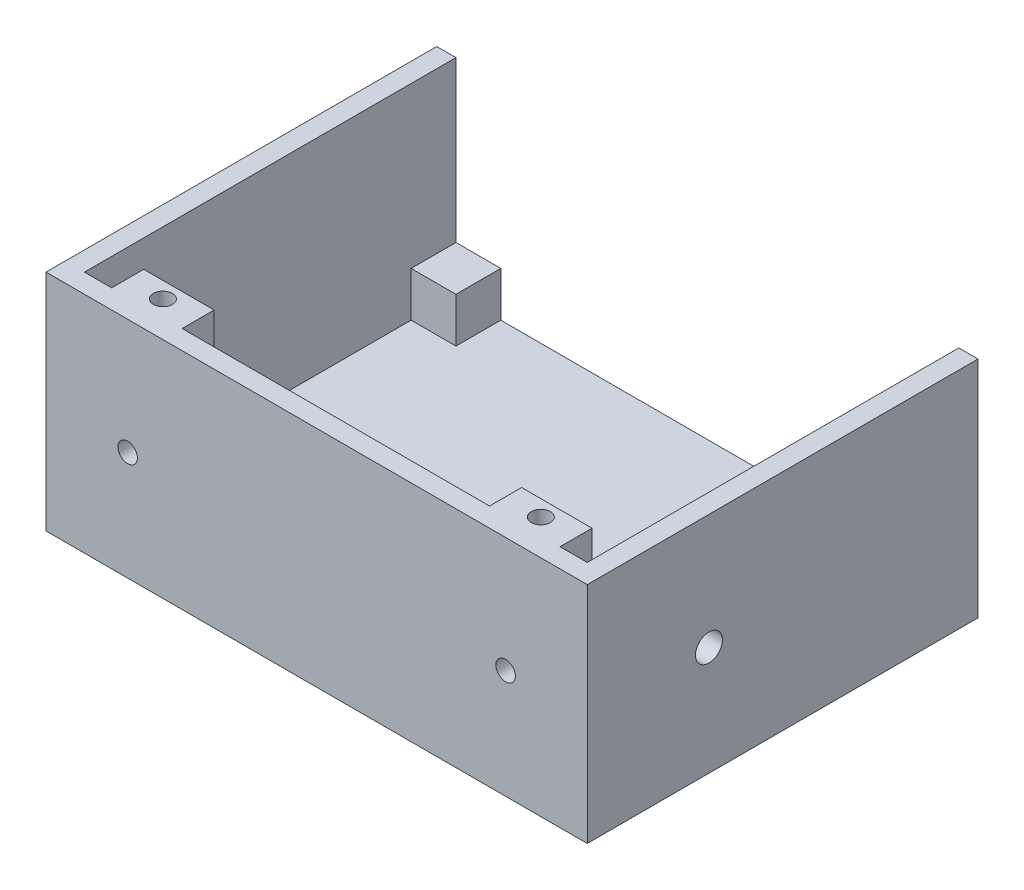
ISO-10303-21;
HEADER;
FILE_DESCRIPTION(('STEP AP214'),'2;1');
FILE_NAME('part.step','',(''),(''),'','','');
FILE_SCHEMA(('AUTOMOTIVE_DESIGN { 1 0 10303 214 1 1 1 1 }'));
ENDSEC;
DATA;
#1=APPLICATION_CONTEXT('core data for automotive mechanical design processes');
#2=APPLICATION_PROTOCOL_DEFINITION('international standard','automotive_design',2000,#1);
#3=PRODUCT_CONTEXT('',#1,'mechanical');
#4=PRODUCT('Part','Part','',(#3));
#5=PRODUCT_RELATED_PRODUCT_CATEGORY('part','',(#4));
#6=PRODUCT_DEFINITION_FORMATION('','',#4);
#7=PRODUCT_DEFINITION_CONTEXT('part definition',#1,'design');
#8=PRODUCT_DEFINITION('design','',#6,#7);
#9=PRODUCT_DEFINITION_SHAPE('','',#8);
#10=(LENGTH_UNIT() NAMED_UNIT(*) SI_UNIT(.MILLI.,.METRE.));
#11=(NAMED_UNIT(*) PLANE_ANGLE_UNIT() SI_UNIT($,.RADIAN.));
#12=(NAMED_UNIT(*) SI_UNIT($,.STERADIAN.) SOLID_ANGLE_UNIT());
#13=UNCERTAINTY_MEASURE_WITH_UNIT(LENGTH_MEASURE(1.E-05),#10,'distance_accuracy_value','');
#14=(GEOMETRIC_REPRESENTATION_CONTEXT(3) GLOBAL_UNCERTAINTY_ASSIGNED_CONTEXT((#13)) GLOBAL_UNIT_ASSIGNED_CONTEXT((#10,
#11,#12)) REPRESENTATION_CONTEXT('',''));
#15=CARTESIAN_POINT('',(0.,0.,0.));
#16=DIRECTION('',(0.,0.,1.));
#17=DIRECTION('',(1.,0.,0.));
#18=AXIS2_PLACEMENT_3D('',#15,#16,#17);
#19=CARTESIAN_POINT('',(42.25,3.,-58.));
#20=DIRECTION('',(0.,1.,0.));
#21=DIRECTION('',(0.,0.,1.));
#22=AXIS2_PLACEMENT_3D('',#19,#20,#21);
#23=PLANE('',#22);
#24=DIRECTION('',(0.,0.,1.));
#25=VECTOR('',#24,1.);
#26=CARTESIAN_POINT('',(-32.25,3.,-58.));
#27=LINE('',#26,#25);
#28=CARTESIAN_POINT('',(-32.25,3.,-58.));
#29=VERTEX_POINT('',#28);
#30=CARTESIAN_POINT('',(-32.25,3.,-51.));
#31=VERTEX_POINT('',#30);
#32=EDGE_CURVE('E107',#29,#31,#27,.T.);
#33=ORIENTED_EDGE('',*,*,#32,.T.);
#34=DIRECTION('',(1.,0.,0.));
#35=VECTOR('',#34,1.);
#36=CARTESIAN_POINT('',(-39.25,3.,-51.));
#37=LINE('',#36,#35);
#38=CARTESIAN_POINT('',(-39.25,3.,-51.));
#39=VERTEX_POINT('',#38);
#40=EDGE_CURVE('E265',#39,#31,#37,.T.);
#41=ORIENTED_EDGE('',*,*,#40,.F.);
#42=DIRECTION('',(0.,0.,1.));
#43=VECTOR('',#42,1.);
#44=CARTESIAN_POINT('',(-39.25,3.,-58.));
#45=LINE('',#44,#43);
#46=CARTESIAN_POINT('',(-39.25,3.,0.));
#47=VERTEX_POINT('',#46);
#48=EDGE_CURVE('E245',#39,#47,#45,.T.);
#49=ORIENTED_EDGE('',*,*,#48,.T.);
#50=DIRECTION('',(-1.,0.,0.));
#51=VECTOR('',#50,1.);
#52=CARTESIAN_POINT('',(42.25,3.,0.));
#53=LINE('',#52,#51);
#54=CARTESIAN_POINT('',(39.25,3.,0.));
#55=VERTEX_POINT('',#54);
#56=EDGE_CURVE('E393',#55,#47,#53,.T.);
#57=ORIENTED_EDGE('',*,*,#56,.F.);
#58=DIRECTION('',(0.,0.,1.));
#59=VECTOR('',#58,1.);
#60=CARTESIAN_POINT('',(39.25,3.,-58.));
#61=LINE('',#60,#59);
#62=CARTESIAN_POINT('',(39.25,3.,-51.));
#63=VERTEX_POINT('',#62);
#64=EDGE_CURVE('E369',#63,#55,#61,.T.);
#65=ORIENTED_EDGE('',*,*,#64,.F.);
#66=DIRECTION('',(-1.,0.,0.));
#67=VECTOR('',#66,1.);
#68=CARTESIAN_POINT('',(0.,3.,-51.));
#69=LINE('',#68,#67);
#70=CARTESIAN_POINT('',(32.25,3.,-51.));
#71=VERTEX_POINT('',#70);
#72=EDGE_CURVE('E274',#63,#71,#69,.T.);
#73=ORIENTED_EDGE('',*,*,#72,.T.);
#74=DIRECTION('',(0.,0.,1.));
#75=VECTOR('',#74,1.);
#76=CARTESIAN_POINT('',(32.25,3.,0.));
#77=LINE('',#76,#75);
#78=CARTESIAN_POINT('',(32.25,3.,-58.));
#79=VERTEX_POINT('',#78);
#80=EDGE_CURVE('E283',#79,#71,#77,.T.);
#81=ORIENTED_EDGE('',*,*,#80,.F.);
#82=DIRECTION('',(-1.,0.,0.));
#83=VECTOR('',#82,1.);
#84=CARTESIAN_POINT('',(42.25,3.,-58.));
#85=LINE('',#84,#83);
#86=EDGE_CURVE('E112',#79,#29,#85,.T.);
#87=ORIENTED_EDGE('',*,*,#86,.T.);
#88=EDGE_LOOP('',(#33,#41,#49,#57,#65,#73,#81,#87));
#89=FACE_BOUND('',#88,.T.);
#90=ADVANCED_FACE('F90',(#89),#23,.T.);
#91=CARTESIAN_POINT('',(-39.25,0.,-58.));
#92=DIRECTION('',(-1.,0.,0.));
#93=DIRECTION('',(0.,0.,1.));
#94=AXIS2_PLACEMENT_3D('',#91,#92,#93);
#95=PLANE('',#94);
#96=DIRECTION('',(0.,-1.,0.));
#97=VECTOR('',#96,1.);
#98=CARTESIAN_POINT('',(-39.25,10.,-51.));
#99=LINE('',#98,#97);
#100=CARTESIAN_POINT('',(-39.25,10.,-51.));
#101=VERTEX_POINT('',#100);
#102=EDGE_CURVE('E239',#101,#39,#99,.T.);
#103=ORIENTED_EDGE('',*,*,#102,.F.);
#104=DIRECTION('',(0.,0.,1.));
#105=VECTOR('',#104,1.);
#106=CARTESIAN_POINT('',(-39.25,10.,-58.));
#107=LINE('',#106,#105);
#108=CARTESIAN_POINT('',(-39.25,10.,-58.));
#109=VERTEX_POINT('',#108);
#110=EDGE_CURVE('E242',#109,#101,#107,.T.);
#111=ORIENTED_EDGE('',*,*,#110,.F.);
#112=DIRECTION('',(0.,-1.,0.));
#113=VECTOR('',#112,1.);
#114=CARTESIAN_POINT('',(-39.25,0.,-58.));
#115=LINE('',#114,#113);
#116=CARTESIAN_POINT('',(-39.25,35.,-58.));
#117=VERTEX_POINT('',#116);
#118=EDGE_CURVE('E386',#117,#109,#115,.T.);
#119=ORIENTED_EDGE('',*,*,#118,.F.);
#120=DIRECTION('',(0.,0.,1.));
#121=VECTOR('',#120,1.);
#122=CARTESIAN_POINT('',(-39.25,35.,-58.));
#123=LINE('',#122,#121);
#124=CARTESIAN_POINT('',(-39.25,35.,0.));
#125=VERTEX_POINT('',#124);
#126=EDGE_CURVE('E390',#117,#125,#123,.T.);
#127=ORIENTED_EDGE('',*,*,#126,.T.);
#128=DIRECTION('',(0.,-1.,0.));
#129=VECTOR('',#128,1.);
#130=CARTESIAN_POINT('',(-39.25,0.,0.));
#131=LINE('',#130,#129);
#132=EDGE_CURVE('E378',#125,#47,#131,.T.);
#133=ORIENTED_EDGE('',*,*,#132,.T.);
#134=ORIENTED_EDGE('',*,*,#48,.F.);
#135=EDGE_LOOP('',(#103,#111,#119,#127,#133,#134));
#136=FACE_BOUND('',#135,.T.);
#137=ADVANCED_FACE('F241',(#136),#95,.F.);
#138=CARTESIAN_POINT('',(0.,0.,0.));
#139=DIRECTION('',(0.,0.,1.));
#140=DIRECTION('',(1.,0.,0.));
#141=AXIS2_PLACEMENT_3D('',#138,#139,#140);
#142=PLANE('',#141);
#143=CARTESIAN_POINT('',(29.5,17.,0.));
#144=DIRECTION('',(0.,0.,1.));
#145=DIRECTION('',(1.,0.,0.));
#146=AXIS2_PLACEMENT_3D('',#143,#144,#145);
#147=CIRCLE('',#146,1.52);
#148=CARTESIAN_POINT('',(31.02,17.,0.));
#149=VERTEX_POINT('',#148);
#150=EDGE_CURVE('E404',#149,#149,#147,.T.);
#151=ORIENTED_EDGE('',*,*,#150,.T.);
#152=EDGE_LOOP('',(#151));
#153=FACE_BOUND('',#152,.T.);
#154=CARTESIAN_POINT('',(-29.5,17.,0.));
#155=DIRECTION('',(0.,0.,1.));
#156=DIRECTION('',(1.,0.,0.));
#157=AXIS2_PLACEMENT_3D('',#154,#155,#156);
#158=CIRCLE('',#157,1.52);
#159=CARTESIAN_POINT('',(-27.98,17.,0.));
#160=VERTEX_POINT('',#159);
#161=EDGE_CURVE('E410',#160,#160,#158,.T.);
#162=ORIENTED_EDGE('',*,*,#161,.T.);
#163=EDGE_LOOP('',(#162));
#164=FACE_BOUND('',#163,.T.);
#165=DIRECTION('',(1.,0.,0.));
#166=VECTOR('',#165,1.);
#167=CARTESIAN_POINT('',(0.,35.,0.));
#168=LINE('',#167,#166);
#169=CARTESIAN_POINT('',(-35.,35.,0.));
#170=VERTEX_POINT('',#169);
#171=EDGE_CURVE('E423',#125,#170,#168,.T.);
#172=ORIENTED_EDGE('',*,*,#171,.T.);
#173=DIRECTION('',(0.,-1.,0.));
#174=VECTOR('',#173,1.);
#175=CARTESIAN_POINT('',(-35.,35.,0.));
#176=LINE('',#175,#174);
#177=CARTESIAN_POINT('',(-35.,28.,0.));
#178=VERTEX_POINT('',#177);
#179=EDGE_CURVE('E325',#170,#178,#176,.T.);
#180=ORIENTED_EDGE('',*,*,#179,.T.);
#181=DIRECTION('',(1.,0.,0.));
#182=VECTOR('',#181,1.);
#183=CARTESIAN_POINT('',(-29.5,28.,0.));
#184=LINE('',#183,#182);
#185=CARTESIAN_POINT('',(-24.,28.,0.));
#186=VERTEX_POINT('',#185);
#187=EDGE_CURVE('E319',#178,#186,#184,.T.);
#188=ORIENTED_EDGE('',*,*,#187,.T.);
#189=DIRECTION('',(0.,-1.,0.));
#190=VECTOR('',#189,1.);
#191=CARTESIAN_POINT('',(-24.,35.,0.));
#192=LINE('',#191,#190);
#193=CARTESIAN_POINT('',(-24.,35.,0.));
#194=VERTEX_POINT('',#193);
#195=EDGE_CURVE('E321',#194,#186,#192,.T.);
#196=ORIENTED_EDGE('',*,*,#195,.F.);
#197=CARTESIAN_POINT('',(24.,35.,0.));
#198=VERTEX_POINT('',#197);
#199=EDGE_CURVE('E431',#194,#198,#168,.T.);
#200=ORIENTED_EDGE('',*,*,#199,.T.);
#201=DIRECTION('',(0.,1.,0.));
#202=VECTOR('',#201,1.);
#203=CARTESIAN_POINT('',(24.,0.,0.));
#204=LINE('',#203,#202);
#205=CARTESIAN_POINT('',(24.,28.,0.));
#206=VERTEX_POINT('',#205);
#207=EDGE_CURVE('E341',#206,#198,#204,.T.);
#208=ORIENTED_EDGE('',*,*,#207,.F.);
#209=DIRECTION('',(1.,0.,0.));
#210=VECTOR('',#209,1.);
#211=CARTESIAN_POINT('',(0.,28.,0.));
#212=LINE('',#211,#210);
#213=CARTESIAN_POINT('',(35.,28.,0.));
#214=VERTEX_POINT('',#213);
#215=EDGE_CURVE('E351',#206,#214,#212,.T.);
#216=ORIENTED_EDGE('',*,*,#215,.T.);
#217=DIRECTION('',(0.,1.,0.));
#218=VECTOR('',#217,1.);
#219=CARTESIAN_POINT('',(35.,0.,0.));
#220=LINE('',#219,#218);
#221=CARTESIAN_POINT('',(35.,35.,0.));
#222=VERTEX_POINT('',#221);
#223=EDGE_CURVE('E327',#214,#222,#220,.T.);
#224=ORIENTED_EDGE('',*,*,#223,.T.);
#225=CARTESIAN_POINT('',(39.25,35.,0.));
#226=VERTEX_POINT('',#225);
#227=EDGE_CURVE('E416',#222,#226,#168,.T.);
#228=ORIENTED_EDGE('',*,*,#227,.T.);
#229=DIRECTION('',(0.,-1.,0.));
#230=VECTOR('',#229,1.);
#231=CARTESIAN_POINT('',(39.25,35.,0.));
#232=LINE('',#231,#230);
#233=EDGE_CURVE('E375',#226,#55,#232,.T.);
#234=ORIENTED_EDGE('',*,*,#233,.T.);
#235=ORIENTED_EDGE('',*,*,#56,.T.);
#236=ORIENTED_EDGE('',*,*,#132,.F.);
#237=EDGE_LOOP('',(#172,#180,#188,#196,#200,#208,#216,#224,#228,#234,#235,#236));
#238=FACE_BOUND('',#237,.T.);
#239=ADVANCED_FACE('F455',(#153,#164,#238),#142,.F.);
#240=CARTESIAN_POINT('',(0.,0.,3.));
#241=DIRECTION('',(0.,0.,1.));
#242=DIRECTION('',(1.,0.,0.));
#243=AXIS2_PLACEMENT_3D('',#240,#241,#242);
#244=PLANE('',#243);
#245=CARTESIAN_POINT('',(-29.5,17.,3.));
#246=DIRECTION('',(0.,0.,1.));
#247=DIRECTION('',(1.,0.,0.));
#248=AXIS2_PLACEMENT_3D('',#245,#246,#247);
#249=CIRCLE('',#248,1.52);
#250=CARTESIAN_POINT('',(-27.98,17.,3.));
#251=VERTEX_POINT('',#250);
#252=EDGE_CURVE('E413',#251,#251,#249,.T.);
#253=ORIENTED_EDGE('',*,*,#252,.F.);
#254=EDGE_LOOP('',(#253));
#255=FACE_BOUND('',#254,.T.);
#256=DIRECTION('',(-1.,0.,0.));
#257=VECTOR('',#256,1.);
#258=CARTESIAN_POINT('',(0.,0.,3.));
#259=LINE('',#258,#257);
#260=CARTESIAN_POINT('',(42.25,0.,3.));
#261=VERTEX_POINT('',#260);
#262=CARTESIAN_POINT('',(-42.25,0.,3.));
#263=VERTEX_POINT('',#262);
#264=EDGE_CURVE('E419',#261,#263,#259,.T.);
#265=ORIENTED_EDGE('',*,*,#264,.F.);
#266=DIRECTION('',(0.,-1.,0.));
#267=VECTOR('',#266,1.);
#268=CARTESIAN_POINT('',(42.25,35.,3.));
#269=LINE('',#268,#267);
#270=CARTESIAN_POINT('',(42.25,35.,3.));
#271=VERTEX_POINT('',#270);
#272=EDGE_CURVE('E427',#271,#261,#269,.T.);
#273=ORIENTED_EDGE('',*,*,#272,.F.);
#274=DIRECTION('',(-1.,0.,0.));
#275=VECTOR('',#274,1.);
#276=CARTESIAN_POINT('',(0.,35.,3.));
#277=LINE('',#276,#275);
#278=CARTESIAN_POINT('',(-42.25,35.,3.));
#279=VERTEX_POINT('',#278);
#280=EDGE_CURVE('E425',#271,#279,#277,.T.);
#281=ORIENTED_EDGE('',*,*,#280,.T.);
#282=DIRECTION('',(0.,-1.,0.));
#283=VECTOR('',#282,1.);
#284=CARTESIAN_POINT('',(-42.25,35.,3.));
#285=LINE('',#284,#283);
#286=EDGE_CURVE('E422',#279,#263,#285,.T.);
#287=ORIENTED_EDGE('',*,*,#286,.T.);
#288=EDGE_LOOP('',(#265,#273,#281,#287));
#289=FACE_BOUND('',#288,.T.);
#290=CARTESIAN_POINT('',(29.5,17.,3.));
#291=DIRECTION('',(0.,0.,1.));
#292=DIRECTION('',(1.,0.,0.));
#293=AXIS2_PLACEMENT_3D('',#290,#291,#292);
#294=CIRCLE('',#293,1.52);
#295=CARTESIAN_POINT('',(31.02,17.,3.));
#296=VERTEX_POINT('',#295);
#297=EDGE_CURVE('E407',#296,#296,#294,.T.);
#298=ORIENTED_EDGE('',*,*,#297,.F.);
#299=EDGE_LOOP('',(#298));
#300=FACE_BOUND('',#299,.T.);
#301=ADVANCED_FACE('F514',(#255,#289,#300),#244,.T.);
#302=CARTESIAN_POINT('',(0.,0.,3.));
#303=DIRECTION('',(0.,1.,0.));
#304=DIRECTION('',(0.,0.,1.));
#305=AXIS2_PLACEMENT_3D('',#302,#303,#304);
#306=PLANE('',#305);
#307=DIRECTION('',(0.,0.,-1.));
#308=VECTOR('',#307,1.);
#309=CARTESIAN_POINT('',(-42.25,0.,3.));
#310=LINE('',#309,#308);
#311=CARTESIAN_POINT('',(-42.25,0.,-58.));
#312=VERTEX_POINT('',#311);
#313=EDGE_CURVE('E430',#263,#312,#310,.T.);
#314=ORIENTED_EDGE('',*,*,#313,.T.);
#315=DIRECTION('',(-1.,0.,0.));
#316=VECTOR('',#315,1.);
#317=CARTESIAN_POINT('',(42.25,0.,-58.));
#318=LINE('',#317,#316);
#319=CARTESIAN_POINT('',(42.25,0.,-58.));
#320=VERTEX_POINT('',#319);
#321=EDGE_CURVE('E398',#320,#312,#318,.T.);
#322=ORIENTED_EDGE('',*,*,#321,.F.);
#323=DIRECTION('',(0.,0.,-1.));
#324=VECTOR('',#323,1.);
#325=CARTESIAN_POINT('',(42.25,0.,3.));
#326=LINE('',#325,#324);
#327=EDGE_CURVE('E12',#261,#320,#326,.T.);
#328=ORIENTED_EDGE('',*,*,#327,.F.);
#329=ORIENTED_EDGE('',*,*,#264,.T.);
#330=EDGE_LOOP('',(#314,#322,#328,#329));
#331=FACE_BOUND('',#330,.T.);
#332=ADVANCED_FACE('F438',(#331),#306,.F.);
#333=CARTESIAN_POINT('',(42.25,35.,3.));
#334=DIRECTION('',(1.,0.,0.));
#335=DIRECTION('',(0.,0.,-1.));
#336=AXIS2_PLACEMENT_3D('',#333,#334,#335);
#337=PLANE('',#336);
#338=CARTESIAN_POINT('',(42.25,17.,-16.));
#339=DIRECTION('',(1.,0.,0.));
#340=DIRECTION('',(0.,0.,-1.));
#341=AXIS2_PLACEMENT_3D('',#338,#339,#340);
#342=CIRCLE('',#341,2.1);
#343=CARTESIAN_POINT('',(42.25,17.,-18.1));
#344=VERTEX_POINT('',#343);
#345=EDGE_CURVE('E366',#344,#344,#342,.T.);
#346=ORIENTED_EDGE('',*,*,#345,.F.);
#347=EDGE_LOOP('',(#346));
#348=FACE_BOUND('',#347,.T.);
#349=DIRECTION('',(0.,1.,0.));
#350=VECTOR('',#349,1.);
#351=CARTESIAN_POINT('',(42.25,0.,-58.));
#352=LINE('',#351,#350);
#353=CARTESIAN_POINT('',(42.25,35.,-58.));
#354=VERTEX_POINT('',#353);
#355=EDGE_CURVE('E401',#320,#354,#352,.T.);
#356=ORIENTED_EDGE('',*,*,#355,.T.);
#357=DIRECTION('',(0.,0.,-1.));
#358=VECTOR('',#357,1.);
#359=CARTESIAN_POINT('',(42.25,35.,3.));
#360=LINE('',#359,#358);
#361=EDGE_CURVE('E99',#271,#354,#360,.T.);
#362=ORIENTED_EDGE('',*,*,#361,.F.);
#363=ORIENTED_EDGE('',*,*,#272,.T.);
#364=ORIENTED_EDGE('',*,*,#327,.T.);
#365=EDGE_LOOP('',(#356,#362,#363,#364));
#366=FACE_BOUND('',#365,.T.);
#367=ADVANCED_FACE('F523',(#348,#366),#337,.T.);
#368=CARTESIAN_POINT('',(0.,35.,3.));
#369=DIRECTION('',(0.,1.,0.));
#370=DIRECTION('',(0.,0.,1.));
#371=AXIS2_PLACEMENT_3D('',#368,#369,#370);
#372=PLANE('',#371);
#373=CARTESIAN_POINT('',(-29.5,35.,-2.5));
#374=DIRECTION('',(0.,1.,0.));
#375=DIRECTION('',(0.,0.,1.));
#376=AXIS2_PLACEMENT_3D('',#373,#374,#375);
#377=CIRCLE('',#376,1.49);
#378=CARTESIAN_POINT('',(-29.5,35.,-1.01));
#379=VERTEX_POINT('',#378);
#380=EDGE_CURVE('E299',#379,#379,#377,.T.);
#381=ORIENTED_EDGE('',*,*,#380,.F.);
#382=EDGE_LOOP('',(#381));
#383=FACE_BOUND('',#382,.T.);
#384=CARTESIAN_POINT('',(29.5,35.,-2.5));
#385=DIRECTION('',(0.,1.,0.));
#386=DIRECTION('',(0.,0.,1.));
#387=AXIS2_PLACEMENT_3D('',#384,#385,#386);
#388=CIRCLE('',#387,1.49);
#389=CARTESIAN_POINT('',(29.5,35.,-1.01));
#390=VERTEX_POINT('',#389);
#391=EDGE_CURVE('E294',#390,#390,#388,.T.);
#392=ORIENTED_EDGE('',*,*,#391,.F.);
#393=EDGE_LOOP('',(#392));
#394=FACE_BOUND('',#393,.T.);
#395=ORIENTED_EDGE('',*,*,#171,.F.);
#396=ORIENTED_EDGE('',*,*,#126,.F.);
#397=DIRECTION('',(1.,0.,0.));
#398=VECTOR('',#397,1.);
#399=CARTESIAN_POINT('',(0.,35.,-58.));
#400=LINE('',#399,#398);
#401=CARTESIAN_POINT('',(-42.25,35.,-58.));
#402=VERTEX_POINT('',#401);
#403=EDGE_CURVE('E383',#402,#117,#400,.T.);
#404=ORIENTED_EDGE('',*,*,#403,.F.);
#405=DIRECTION('',(0.,0.,-1.));
#406=VECTOR('',#405,1.);
#407=CARTESIAN_POINT('',(-42.25,35.,3.));
#408=LINE('',#407,#406);
#409=EDGE_CURVE('E434',#279,#402,#408,.T.);
#410=ORIENTED_EDGE('',*,*,#409,.F.);
#411=ORIENTED_EDGE('',*,*,#280,.F.);
#412=ORIENTED_EDGE('',*,*,#361,.T.);
#413=DIRECTION('',(-1.,0.,0.));
#414=VECTOR('',#413,1.);
#415=CARTESIAN_POINT('',(42.25,35.,-58.));
#416=LINE('',#415,#414);
#417=CARTESIAN_POINT('',(39.25,35.,-58.));
#418=VERTEX_POINT('',#417);
#419=EDGE_CURVE('E374',#354,#418,#416,.T.);
#420=ORIENTED_EDGE('',*,*,#419,.T.);
#421=DIRECTION('',(0.,0.,1.));
#422=VECTOR('',#421,1.);
#423=CARTESIAN_POINT('',(39.25,35.,-58.));
#424=LINE('',#423,#422);
#425=EDGE_CURVE('E371',#418,#226,#424,.T.);
#426=ORIENTED_EDGE('',*,*,#425,.T.);
#427=ORIENTED_EDGE('',*,*,#227,.F.);
#428=DIRECTION('',(0.,0.,1.));
#429=VECTOR('',#428,1.);
#430=CARTESIAN_POINT('',(35.,35.,-5.));
#431=LINE('',#430,#429);
#432=CARTESIAN_POINT('',(35.,35.,-5.));
#433=VERTEX_POINT('',#432);
#434=EDGE_CURVE('E348',#433,#222,#431,.T.);
#435=ORIENTED_EDGE('',*,*,#434,.F.);
#436=DIRECTION('',(1.,0.,0.));
#437=VECTOR('',#436,1.);
#438=CARTESIAN_POINT('',(0.,35.,-5.));
#439=LINE('',#438,#437);
#440=CARTESIAN_POINT('',(24.,35.,-5.));
#441=VERTEX_POINT('',#440);
#442=EDGE_CURVE('E346',#441,#433,#439,.T.);
#443=ORIENTED_EDGE('',*,*,#442,.F.);
#444=DIRECTION('',(0.,0.,1.));
#445=VECTOR('',#444,1.);
#446=CARTESIAN_POINT('',(24.,35.,-5.));
#447=LINE('',#446,#445);
#448=EDGE_CURVE('E357',#441,#198,#447,.T.);
#449=ORIENTED_EDGE('',*,*,#448,.T.);
#450=ORIENTED_EDGE('',*,*,#199,.F.);
#451=DIRECTION('',(0.,0.,1.));
#452=VECTOR('',#451,1.);
#453=CARTESIAN_POINT('',(-24.,35.,-5.));
#454=LINE('',#453,#452);
#455=CARTESIAN_POINT('',(-24.,35.,-5.));
#456=VERTEX_POINT('',#455);
#457=EDGE_CURVE('E312',#456,#194,#454,.T.);
#458=ORIENTED_EDGE('',*,*,#457,.F.);
#459=DIRECTION('',(-1.,0.,0.));
#460=VECTOR('',#459,1.);
#461=CARTESIAN_POINT('',(-24.,35.,-5.));
#462=LINE('',#461,#460);
#463=CARTESIAN_POINT('',(-35.,35.,-5.));
#464=VERTEX_POINT('',#463);
#465=EDGE_CURVE('E330',#456,#464,#462,.T.);
#466=ORIENTED_EDGE('',*,*,#465,.T.);
#467=DIRECTION('',(0.,0.,1.));
#468=VECTOR('',#467,1.);
#469=CARTESIAN_POINT('',(-35.,35.,-5.));
#470=LINE('',#469,#468);
#471=EDGE_CURVE('E309',#464,#170,#470,.T.);
#472=ORIENTED_EDGE('',*,*,#471,.T.);
#473=EDGE_LOOP('',(#395,#396,#404,#410,#411,#412,#420,#426,#427,#435,#443,#449,#450,#458,#466,#472));
#474=FACE_BOUND('',#473,.T.);
#475=ADVANCED_FACE('F451',(#383,#394,#474),#372,.T.);
#476=CARTESIAN_POINT('',(-42.25,35.,3.));
#477=DIRECTION('',(1.,0.,0.));
#478=DIRECTION('',(0.,0.,-1.));
#479=AXIS2_PLACEMENT_3D('',#476,#477,#478);
#480=PLANE('',#479);
#481=ORIENTED_EDGE('',*,*,#409,.T.);
#482=DIRECTION('',(0.,1.,0.));
#483=VECTOR('',#482,1.);
#484=CARTESIAN_POINT('',(-42.25,0.,-58.));
#485=LINE('',#484,#483);
#486=EDGE_CURVE('E395',#312,#402,#485,.T.);
#487=ORIENTED_EDGE('',*,*,#486,.F.);
#488=ORIENTED_EDGE('',*,*,#313,.F.);
#489=ORIENTED_EDGE('',*,*,#286,.F.);
#490=EDGE_LOOP('',(#481,#487,#488,#489));
#491=FACE_BOUND('',#490,.T.);
#492=ADVANCED_FACE('F92',(#491),#480,.F.);
#493=CARTESIAN_POINT('',(-29.5,17.,3.));
#494=DIRECTION('',(0.,0.,-1.));
#495=DIRECTION('',(-1.,0.,0.));
#496=AXIS2_PLACEMENT_3D('',#493,#494,#495);
#497=CYLINDRICAL_SURFACE('',#496,1.52);
#498=ORIENTED_EDGE('',*,*,#252,.T.);
#499=EDGE_LOOP('',(#498));
#500=FACE_BOUND('',#499,.T.);
#501=ORIENTED_EDGE('',*,*,#161,.F.);
#502=EDGE_LOOP('',(#501));
#503=FACE_BOUND('',#502,.T.);
#504=ADVANCED_FACE('F509',(#500,#503),#497,.F.);
#505=CARTESIAN_POINT('',(29.5,17.,3.));
#506=DIRECTION('',(0.,0.,-1.));
#507=DIRECTION('',(-1.,0.,0.));
#508=AXIS2_PLACEMENT_3D('',#505,#506,#507);
#509=CYLINDRICAL_SURFACE('',#508,1.52);
#510=ORIENTED_EDGE('',*,*,#297,.T.);
#511=EDGE_LOOP('',(#510));
#512=FACE_BOUND('',#511,.T.);
#513=ORIENTED_EDGE('',*,*,#150,.F.);
#514=EDGE_LOOP('',(#513));
#515=FACE_BOUND('',#514,.T.);
#516=ADVANCED_FACE('F506',(#512,#515),#509,.F.);
#517=CARTESIAN_POINT('',(0.,0.,-58.));
#518=DIRECTION('',(0.,0.,-1.));
#519=DIRECTION('',(-1.,0.,0.));
#520=AXIS2_PLACEMENT_3D('',#517,#518,#519);
#521=PLANE('',#520);
#522=CARTESIAN_POINT('',(35.75,6.5,-58.));
#523=DIRECTION('',(0.,0.,-1.));
#524=DIRECTION('',(-1.,0.,0.));
#525=AXIS2_PLACEMENT_3D('',#522,#523,#524);
#526=CIRCLE('',#525,1.49);
#527=CARTESIAN_POINT('',(34.26,6.5,-58.));
#528=VERTEX_POINT('',#527);
#529=EDGE_CURVE('E761',#528,#528,#526,.T.);
#530=ORIENTED_EDGE('',*,*,#529,.F.);
#531=EDGE_LOOP('',(#530));
#532=FACE_BOUND('',#531,.T.);
#533=CARTESIAN_POINT('',(-35.75,6.5,-58.));
#534=DIRECTION('',(0.,0.,-1.));
#535=DIRECTION('',(-1.,0.,0.));
#536=AXIS2_PLACEMENT_3D('',#533,#534,#535);
#537=CIRCLE('',#536,1.49);
#538=CARTESIAN_POINT('',(-37.24,6.5,-58.));
#539=VERTEX_POINT('',#538);
#540=EDGE_CURVE('E765',#539,#539,#537,.T.);
#541=ORIENTED_EDGE('',*,*,#540,.F.);
#542=EDGE_LOOP('',(#541));
#543=FACE_BOUND('',#542,.T.);
#544=DIRECTION('',(0.,-1.,0.));
#545=VECTOR('',#544,1.);
#546=CARTESIAN_POINT('',(-32.25,10.,-58.));
#547=LINE('',#546,#545);
#548=CARTESIAN_POINT('',(-32.25,10.,-58.));
#549=VERTEX_POINT('',#548);
#550=EDGE_CURVE('E249',#549,#29,#547,.T.);
#551=ORIENTED_EDGE('',*,*,#550,.T.);
#552=ORIENTED_EDGE('',*,*,#86,.F.);
#553=DIRECTION('',(0.,-1.,0.));
#554=VECTOR('',#553,1.);
#555=CARTESIAN_POINT('',(32.25,10.,-58.));
#556=LINE('',#555,#554);
#557=CARTESIAN_POINT('',(32.25,10.,-58.));
#558=VERTEX_POINT('',#557);
#559=EDGE_CURVE('E291',#558,#79,#556,.T.);
#560=ORIENTED_EDGE('',*,*,#559,.F.);
#561=DIRECTION('',(-1.,0.,0.));
#562=VECTOR('',#561,1.);
#563=CARTESIAN_POINT('',(0.,10.,-58.));
#564=LINE('',#563,#562);
#565=CARTESIAN_POINT('',(39.25,10.,-58.));
#566=VERTEX_POINT('',#565);
#567=EDGE_CURVE('E270',#566,#558,#564,.T.);
#568=ORIENTED_EDGE('',*,*,#567,.F.);
#569=DIRECTION('',(0.,-1.,0.));
#570=VECTOR('',#569,1.);
#571=CARTESIAN_POINT('',(39.25,35.,-58.));
#572=LINE('',#571,#570);
#573=EDGE_CURVE('E379',#418,#566,#572,.T.);
#574=ORIENTED_EDGE('',*,*,#573,.F.);
#575=ORIENTED_EDGE('',*,*,#419,.F.);
#576=ORIENTED_EDGE('',*,*,#355,.F.);
#577=ORIENTED_EDGE('',*,*,#321,.T.);
#578=ORIENTED_EDGE('',*,*,#486,.T.);
#579=ORIENTED_EDGE('',*,*,#403,.T.);
#580=ORIENTED_EDGE('',*,*,#118,.T.);
#581=DIRECTION('',(1.,0.,0.));
#582=VECTOR('',#581,1.);
#583=CARTESIAN_POINT('',(-39.25,10.,-58.));
#584=LINE('',#583,#582);
#585=EDGE_CURVE('E258',#109,#549,#584,.T.);
#586=ORIENTED_EDGE('',*,*,#585,.T.);
#587=EDGE_LOOP('',(#551,#552,#560,#568,#574,#575,#576,#577,#578,#579,#580,#586));
#588=FACE_BOUND('',#587,.T.);
#589=ADVANCED_FACE('F445',(#532,#543,#588),#521,.T.);
#590=CARTESIAN_POINT('',(39.25,35.,-58.));
#591=DIRECTION('',(-1.,0.,0.));
#592=DIRECTION('',(0.,-1.,0.));
#593=AXIS2_PLACEMENT_3D('',#590,#591,#592);
#594=PLANE('',#593);
#595=DIRECTION('',(0.,-1.,0.));
#596=VECTOR('',#595,1.);
#597=CARTESIAN_POINT('',(39.25,10.,-51.));
#598=LINE('',#597,#596);
#599=CARTESIAN_POINT('',(39.25,10.,-51.));
#600=VERTEX_POINT('',#599);
#601=EDGE_CURVE('E282',#600,#63,#598,.T.);
#602=ORIENTED_EDGE('',*,*,#601,.T.);
#603=ORIENTED_EDGE('',*,*,#64,.T.);
#604=ORIENTED_EDGE('',*,*,#233,.F.);
#605=ORIENTED_EDGE('',*,*,#425,.F.);
#606=ORIENTED_EDGE('',*,*,#573,.T.);
#607=DIRECTION('',(0.,0.,-1.));
#608=VECTOR('',#607,1.);
#609=CARTESIAN_POINT('',(39.25,10.,0.));
#610=LINE('',#609,#608);
#611=EDGE_CURVE('E279',#600,#566,#610,.T.);
#612=ORIENTED_EDGE('',*,*,#611,.F.);
#613=EDGE_LOOP('',(#602,#603,#604,#605,#606,#612));
#614=FACE_BOUND('',#613,.T.);
#615=CARTESIAN_POINT('',(39.25,17.,-16.));
#616=DIRECTION('',(-1.,0.,0.));
#617=DIRECTION('',(0.,-1.,0.));
#618=AXIS2_PLACEMENT_3D('',#615,#616,#617);
#619=CIRCLE('',#618,2.1);
#620=CARTESIAN_POINT('',(39.25,17.,-18.1));
#621=VERTEX_POINT('',#620);
#622=EDGE_CURVE('E94',#621,#621,#619,.T.);
#623=ORIENTED_EDGE('',*,*,#622,.F.);
#624=EDGE_LOOP('',(#623));
#625=FACE_BOUND('',#624,.T.);
#626=ADVANCED_FACE('F495',(#614,#625),#594,.T.);
#627=CARTESIAN_POINT('',(-15.75,17.,-16.));
#628=DIRECTION('',(1.,0.,0.));
#629=DIRECTION('',(0.,0.,-1.));
#630=AXIS2_PLACEMENT_3D('',#627,#628,#629);
#631=CYLINDRICAL_SURFACE('',#630,2.1);
#632=CARTESIAN_POINT('',(39.25,17.,-18.1));
#633=CARTESIAN_POINT('',(39.28125,17.,-18.1));
#634=CARTESIAN_POINT('',(39.3125,17.,-18.1));
#635=CARTESIAN_POINT('',(39.375,17.,-18.1));
#636=CARTESIAN_POINT('',(39.40625,17.,-18.1));
#637=CARTESIAN_POINT('',(39.46875,17.,-18.1));
#638=CARTESIAN_POINT('',(39.5,17.,-18.1));
#639=CARTESIAN_POINT('',(39.5625,17.,-18.1));
#640=CARTESIAN_POINT('',(39.59375,17.,-18.1));
#641=CARTESIAN_POINT('',(39.65625,17.,-18.1));
#642=CARTESIAN_POINT('',(39.6875,17.,-18.1));
#643=CARTESIAN_POINT('',(39.75,17.,-18.1));
#644=CARTESIAN_POINT('',(39.78125,17.,-18.1));
#645=CARTESIAN_POINT('',(39.84375,17.,-18.1));
#646=CARTESIAN_POINT('',(39.875,17.,-18.1));
#647=CARTESIAN_POINT('',(39.9375,17.,-18.1));
#648=CARTESIAN_POINT('',(39.96875,17.,-18.1));
#649=CARTESIAN_POINT('',(40.03125,17.,-18.1));
#650=CARTESIAN_POINT('',(40.0625,17.,-18.1));
#651=CARTESIAN_POINT('',(40.125,17.,-18.1));
#652=CARTESIAN_POINT('',(40.15625,17.,-18.1));
#653=CARTESIAN_POINT('',(40.21875,17.,-18.1));
#654=CARTESIAN_POINT('',(40.25,17.,-18.1));
#655=CARTESIAN_POINT('',(40.3125,17.,-18.1));
#656=CARTESIAN_POINT('',(40.34375,17.,-18.1));
#657=CARTESIAN_POINT('',(40.40625,17.,-18.1));
#658=CARTESIAN_POINT('',(40.4375,17.,-18.1));
#659=CARTESIAN_POINT('',(40.5,17.,-18.1));
#660=CARTESIAN_POINT('',(40.53125,17.,-18.1));
#661=CARTESIAN_POINT('',(40.59375,17.,-18.1));
#662=CARTESIAN_POINT('',(40.625,17.,-18.1));
#663=CARTESIAN_POINT('',(40.6875,17.,-18.1));
#664=CARTESIAN_POINT('',(40.71875,17.,-18.1));
#665=CARTESIAN_POINT('',(40.78125,17.,-18.1));
#666=CARTESIAN_POINT('',(40.8125,17.,-18.1));
#667=CARTESIAN_POINT('',(40.875,17.,-18.1));
#668=CARTESIAN_POINT('',(40.90625,17.,-18.1));
#669=CARTESIAN_POINT('',(40.96875,17.,-18.1));
#670=CARTESIAN_POINT('',(41.,17.,-18.1));
#671=CARTESIAN_POINT('',(41.0625,17.,-18.1));
#672=CARTESIAN_POINT('',(41.09375,17.,-18.1));
#673=CARTESIAN_POINT('',(41.15625,17.,-18.1));
#674=CARTESIAN_POINT('',(41.1875,17.,-18.1));
#675=CARTESIAN_POINT('',(41.25,17.,-18.1));
#676=CARTESIAN_POINT('',(41.28125,17.,-18.1));
#677=CARTESIAN_POINT('',(41.34375,17.,-18.1));
#678=CARTESIAN_POINT('',(41.375,17.,-18.1));
#679=CARTESIAN_POINT('',(41.4375,17.,-18.1));
#680=CARTESIAN_POINT('',(41.46875,17.,-18.1));
#681=CARTESIAN_POINT('',(41.53125,17.,-18.1));
#682=CARTESIAN_POINT('',(41.5625,17.,-18.1));
#683=CARTESIAN_POINT('',(41.625,17.,-18.1));
#684=CARTESIAN_POINT('',(41.65625,17.,-18.1));
#685=CARTESIAN_POINT('',(41.71875,17.,-18.1));
#686=CARTESIAN_POINT('',(41.75,17.,-18.1));
#687=CARTESIAN_POINT('',(41.8125,17.,-18.1));
#688=CARTESIAN_POINT('',(41.84375,17.,-18.1));
#689=CARTESIAN_POINT('',(41.90625,17.,-18.1));
#690=CARTESIAN_POINT('',(41.9375,17.,-18.1));
#691=CARTESIAN_POINT('',(42.,17.,-18.1));
#692=CARTESIAN_POINT('',(42.03125,17.,-18.1));
#693=CARTESIAN_POINT('',(42.09375,17.,-18.1));
#694=CARTESIAN_POINT('',(42.125,17.,-18.1));
#695=CARTESIAN_POINT('',(42.1875,17.,-18.1));
#696=CARTESIAN_POINT('',(42.21875,17.,-18.1));
#697=CARTESIAN_POINT('',(42.25,17.,-18.1));
#698=B_SPLINE_CURVE_WITH_KNOTS('',3,(#632,#633,#634,#635,#636,#637,#638,#639,#640,#641,#642,
#643,#644,#645,#646,#647,#648,#649,#650,#651,#652,#653,#654,#655,#656,#657,#658,#659,#660,#661,
#662,#663,#664,#665,#666,#667,#668,#669,#670,#671,#672,#673,#674,#675,#676,#677,#678,#679,#680,
#681,#682,#683,#684,#685,#686,#687,#688,#689,#690,#691,#692,#693,#694,#695,#696,#697),
.UNSPECIFIED.,.F.,.F.,(4,2,2,2,2,2,2,2,2,2,2,2,2,2,2,2,2,2,2,2,2,2,2,2,2,2,2,2,2,2,2,2,4),(0.,
0.0937500000000036,0.1875,0.281249999999997,0.375,0.468750000000004,0.5625,0.656249999999997,
0.750000000000001,0.843750000000004,0.937500000000001,1.03125,1.125,1.21875,1.3125,1.40625,1.5,
1.59375,1.6875,1.78125,1.875,1.96875000000001,2.0625,2.15625,2.25,2.34375000000001,2.4375,
2.53125,2.625,2.71875000000001,2.8125,2.90625,3.),.UNSPECIFIED.);
#699=EDGE_CURVE('BSEAM488',#621,#344,#698,.T.);
#700=ORIENTED_EDGE('',*,*,#622,.T.);
#701=ORIENTED_EDGE('',*,*,#345,.T.);
#702=ORIENTED_EDGE('',*,*,#699,.T.);
#703=ORIENTED_EDGE('',*,*,#699,.F.);
#704=EDGE_LOOP('',(#700,#702,#701,#703));
#705=FACE_BOUND('',#704,.T.);
#706=ADVANCED_FACE('F488',(#705),#631,.F.);
#707=CARTESIAN_POINT('',(35.,0.,-5.));
#708=DIRECTION('',(1.,0.,0.));
#709=DIRECTION('',(0.,0.,-1.));
#710=AXIS2_PLACEMENT_3D('',#707,#708,#709);
#711=PLANE('',#710);
#712=ORIENTED_EDGE('',*,*,#223,.F.);
#713=DIRECTION('',(0.,0.,1.));
#714=VECTOR('',#713,1.);
#715=CARTESIAN_POINT('',(35.,28.,-5.));
#716=LINE('',#715,#714);
#717=CARTESIAN_POINT('',(35.,28.,-5.));
#718=VERTEX_POINT('',#717);
#719=EDGE_CURVE('E363',#718,#214,#716,.T.);
#720=ORIENTED_EDGE('',*,*,#719,.F.);
#721=DIRECTION('',(0.,1.,0.));
#722=VECTOR('',#721,1.);
#723=CARTESIAN_POINT('',(35.,0.,-5.));
#724=LINE('',#723,#722);
#725=EDGE_CURVE('E337',#718,#433,#724,.T.);
#726=ORIENTED_EDGE('',*,*,#725,.T.);
#727=ORIENTED_EDGE('',*,*,#434,.T.);
#728=EDGE_LOOP('',(#712,#720,#726,#727));
#729=FACE_BOUND('',#728,.T.);
#730=ADVANCED_FACE('F486',(#729),#711,.T.);
#731=CARTESIAN_POINT('',(0.,28.,-5.));
#732=DIRECTION('',(0.,-1.,0.));
#733=DIRECTION('',(0.,0.,-1.));
#734=AXIS2_PLACEMENT_3D('',#731,#732,#733);
#735=PLANE('',#734);
#736=ORIENTED_EDGE('',*,*,#215,.F.);
#737=DIRECTION('',(0.,0.,1.));
#738=VECTOR('',#737,1.);
#739=CARTESIAN_POINT('',(24.,28.,-5.));
#740=LINE('',#739,#738);
#741=CARTESIAN_POINT('',(24.,28.,-5.));
#742=VERTEX_POINT('',#741);
#743=EDGE_CURVE('E360',#742,#206,#740,.T.);
#744=ORIENTED_EDGE('',*,*,#743,.F.);
#745=DIRECTION('',(1.,0.,0.));
#746=VECTOR('',#745,1.);
#747=CARTESIAN_POINT('',(0.,28.,-5.));
#748=LINE('',#747,#746);
#749=EDGE_CURVE('E340',#742,#718,#748,.T.);
#750=ORIENTED_EDGE('',*,*,#749,.T.);
#751=ORIENTED_EDGE('',*,*,#719,.T.);
#752=EDGE_LOOP('',(#736,#744,#750,#751));
#753=FACE_BOUND('',#752,.T.);
#754=ADVANCED_FACE('F483',(#753),#735,.T.);
#755=CARTESIAN_POINT('',(24.,0.,-5.));
#756=DIRECTION('',(1.,0.,0.));
#757=DIRECTION('',(0.,0.,-1.));
#758=AXIS2_PLACEMENT_3D('',#755,#756,#757);
#759=PLANE('',#758);
#760=ORIENTED_EDGE('',*,*,#207,.T.);
#761=ORIENTED_EDGE('',*,*,#448,.F.);
#762=DIRECTION('',(0.,1.,0.));
#763=VECTOR('',#762,1.);
#764=CARTESIAN_POINT('',(24.,0.,-5.));
#765=LINE('',#764,#763);
#766=EDGE_CURVE('E344',#742,#441,#765,.T.);
#767=ORIENTED_EDGE('',*,*,#766,.F.);
#768=ORIENTED_EDGE('',*,*,#743,.T.);
#769=EDGE_LOOP('',(#760,#761,#767,#768));
#770=FACE_BOUND('',#769,.T.);
#771=ADVANCED_FACE('F473',(#770),#759,.F.);
#772=CARTESIAN_POINT('',(0.,0.,-5.));
#773=DIRECTION('',(0.,0.,-1.));
#774=DIRECTION('',(-1.,0.,0.));
#775=AXIS2_PLACEMENT_3D('',#772,#773,#774);
#776=PLANE('',#775);
#777=ORIENTED_EDGE('',*,*,#725,.F.);
#778=ORIENTED_EDGE('',*,*,#749,.F.);
#779=ORIENTED_EDGE('',*,*,#766,.T.);
#780=ORIENTED_EDGE('',*,*,#442,.T.);
#781=EDGE_LOOP('',(#777,#778,#779,#780));
#782=FACE_BOUND('',#781,.T.);
#783=ADVANCED_FACE('F480',(#782),#776,.T.);
#784=CARTESIAN_POINT('',(-35.,35.,-5.));
#785=DIRECTION('',(-1.,0.,0.));
#786=DIRECTION('',(0.,0.,1.));
#787=AXIS2_PLACEMENT_3D('',#784,#785,#786);
#788=PLANE('',#787);
#789=ORIENTED_EDGE('',*,*,#179,.F.);
#790=ORIENTED_EDGE('',*,*,#471,.F.);
#791=DIRECTION('',(0.,-1.,0.));
#792=VECTOR('',#791,1.);
#793=CARTESIAN_POINT('',(-35.,35.,-5.));
#794=LINE('',#793,#792);
#795=CARTESIAN_POINT('',(-35.,28.,-5.));
#796=VERTEX_POINT('',#795);
#797=EDGE_CURVE('E333',#464,#796,#794,.T.);
#798=ORIENTED_EDGE('',*,*,#797,.T.);
#799=DIRECTION('',(0.,0.,1.));
#800=VECTOR('',#799,1.);
#801=CARTESIAN_POINT('',(-35.,28.,-5.));
#802=LINE('',#801,#800);
#803=EDGE_CURVE('E298',#796,#178,#802,.T.);
#804=ORIENTED_EDGE('',*,*,#803,.T.);
#805=EDGE_LOOP('',(#789,#790,#798,#804));
#806=FACE_BOUND('',#805,.T.);
#807=ADVANCED_FACE('F461',(#806),#788,.T.);
#808=CARTESIAN_POINT('',(-24.,35.,-5.));
#809=DIRECTION('',(-1.,0.,0.));
#810=DIRECTION('',(0.,0.,1.));
#811=AXIS2_PLACEMENT_3D('',#808,#809,#810);
#812=PLANE('',#811);
#813=ORIENTED_EDGE('',*,*,#195,.T.);
#814=DIRECTION('',(0.,0.,1.));
#815=VECTOR('',#814,1.);
#816=CARTESIAN_POINT('',(-24.,28.,-5.));
#817=LINE('',#816,#815);
#818=CARTESIAN_POINT('',(-24.,28.,-5.));
#819=VERTEX_POINT('',#818);
#820=EDGE_CURVE('E315',#819,#186,#817,.T.);
#821=ORIENTED_EDGE('',*,*,#820,.F.);
#822=DIRECTION('',(0.,-1.,0.));
#823=VECTOR('',#822,1.);
#824=CARTESIAN_POINT('',(-24.,35.,-5.));
#825=LINE('',#824,#823);
#826=EDGE_CURVE('E318',#456,#819,#825,.T.);
#827=ORIENTED_EDGE('',*,*,#826,.F.);
#828=ORIENTED_EDGE('',*,*,#457,.T.);
#829=EDGE_LOOP('',(#813,#821,#827,#828));
#830=FACE_BOUND('',#829,.T.);
#831=ADVANCED_FACE('F470',(#830),#812,.F.);
#832=CARTESIAN_POINT('',(-29.5,28.,-5.));
#833=DIRECTION('',(0.,-1.,0.));
#834=DIRECTION('',(0.,0.,-1.));
#835=AXIS2_PLACEMENT_3D('',#832,#833,#834);
#836=PLANE('',#835);
#837=ORIENTED_EDGE('',*,*,#187,.F.);
#838=ORIENTED_EDGE('',*,*,#803,.F.);
#839=DIRECTION('',(-1.,0.,0.));
#840=VECTOR('',#839,1.);
#841=CARTESIAN_POINT('',(-29.5,28.,-5.));
#842=LINE('',#841,#840);
#843=EDGE_CURVE('E322',#819,#796,#842,.T.);
#844=ORIENTED_EDGE('',*,*,#843,.F.);
#845=ORIENTED_EDGE('',*,*,#820,.T.);
#846=EDGE_LOOP('',(#837,#838,#844,#845));
#847=FACE_BOUND('',#846,.T.);
#848=ADVANCED_FACE('F466',(#847),#836,.T.);
#849=CARTESIAN_POINT('',(0.,0.,-5.));
#850=DIRECTION('',(0.,0.,1.));
#851=DIRECTION('',(1.,0.,0.));
#852=AXIS2_PLACEMENT_3D('',#849,#850,#851);
#853=PLANE('',#852);
#854=ORIENTED_EDGE('',*,*,#843,.T.);
#855=ORIENTED_EDGE('',*,*,#797,.F.);
#856=ORIENTED_EDGE('',*,*,#465,.F.);
#857=ORIENTED_EDGE('',*,*,#826,.T.);
#858=EDGE_LOOP('',(#854,#855,#856,#857));
#859=FACE_BOUND('',#858,.T.);
#860=ADVANCED_FACE('F538',(#859),#853,.F.);
#861=CARTESIAN_POINT('',(29.5,31.,-2.5));
#862=DIRECTION('',(0.,1.,0.));
#863=DIRECTION('',(0.,0.,1.));
#864=AXIS2_PLACEMENT_3D('',#861,#862,#863);
#865=CYLINDRICAL_SURFACE('',#864,1.49);
#866=CARTESIAN_POINT('',(29.5,31.,-2.5));
#867=DIRECTION('',(0.,1.,0.));
#868=DIRECTION('',(0.,0.,1.));
#869=AXIS2_PLACEMENT_3D('',#866,#867,#868);
#870=CIRCLE('',#869,1.49);
#871=CARTESIAN_POINT('',(29.5,31.,-1.01));
#872=VERTEX_POINT('',#871);
#873=EDGE_CURVE('E302',#872,#872,#870,.T.);
#874=ORIENTED_EDGE('',*,*,#873,.F.);
#875=EDGE_LOOP('',(#874));
#876=FACE_BOUND('',#875,.T.);
#877=ORIENTED_EDGE('',*,*,#391,.T.);
#878=EDGE_LOOP('',(#877));
#879=FACE_BOUND('',#878,.T.);
#880=ADVANCED_FACE('F535',(#876,#879),#865,.F.);
#881=CARTESIAN_POINT('',(0.,31.,0.));
#882=DIRECTION('',(0.,1.,0.));
#883=DIRECTION('',(0.,0.,1.));
#884=AXIS2_PLACEMENT_3D('',#881,#882,#883);
#885=PLANE('',#884);
#886=ORIENTED_EDGE('',*,*,#873,.T.);
#887=EDGE_LOOP('',(#886));
#888=FACE_BOUND('',#887,.T.);
#889=ADVANCED_FACE('F537',(#888),#885,.T.);
#890=CARTESIAN_POINT('',(-29.5,31.,-2.5));
#891=DIRECTION('',(0.,1.,0.));
#892=DIRECTION('',(0.,0.,1.));
#893=AXIS2_PLACEMENT_3D('',#890,#891,#892);
#894=CYLINDRICAL_SURFACE('',#893,1.49);
#895=CARTESIAN_POINT('',(-29.5,31.,-2.5));
#896=DIRECTION('',(0.,1.,0.));
#897=DIRECTION('',(0.,0.,1.));
#898=AXIS2_PLACEMENT_3D('',#895,#896,#897);
#899=CIRCLE('',#898,1.49);
#900=CARTESIAN_POINT('',(-29.5,31.,-1.01));
#901=VERTEX_POINT('',#900);
#902=EDGE_CURVE('E295',#901,#901,#899,.T.);
#903=ORIENTED_EDGE('',*,*,#902,.F.);
#904=EDGE_LOOP('',(#903));
#905=FACE_BOUND('',#904,.T.);
#906=ORIENTED_EDGE('',*,*,#380,.T.);
#907=EDGE_LOOP('',(#906));
#908=FACE_BOUND('',#907,.T.);
#909=ADVANCED_FACE('F545',(#905,#908),#894,.F.);
#910=CARTESIAN_POINT('',(0.,31.,0.));
#911=DIRECTION('',(0.,1.,0.));
#912=DIRECTION('',(0.,0.,1.));
#913=AXIS2_PLACEMENT_3D('',#910,#911,#912);
#914=PLANE('',#913);
#915=ORIENTED_EDGE('',*,*,#902,.T.);
#916=EDGE_LOOP('',(#915));
#917=FACE_BOUND('',#916,.T.);
#918=ADVANCED_FACE('F612',(#917),#914,.T.);
#919=CARTESIAN_POINT('',(32.25,10.,0.));
#920=DIRECTION('',(1.,0.,0.));
#921=DIRECTION('',(0.,0.,-1.));
#922=AXIS2_PLACEMENT_3D('',#919,#920,#921);
#923=PLANE('',#922);
#924=ORIENTED_EDGE('',*,*,#80,.T.);
#925=DIRECTION('',(0.,-1.,0.));
#926=VECTOR('',#925,1.);
#927=CARTESIAN_POINT('',(32.25,10.,-51.));
#928=LINE('',#927,#926);
#929=CARTESIAN_POINT('',(32.25,10.,-51.));
#930=VERTEX_POINT('',#929);
#931=EDGE_CURVE('E288',#930,#71,#928,.T.);
#932=ORIENTED_EDGE('',*,*,#931,.F.);
#933=DIRECTION('',(0.,0.,1.));
#934=VECTOR('',#933,1.);
#935=CARTESIAN_POINT('',(32.25,10.,0.));
#936=LINE('',#935,#934);
#937=EDGE_CURVE('E273',#558,#930,#936,.T.);
#938=ORIENTED_EDGE('',*,*,#937,.F.);
#939=ORIENTED_EDGE('',*,*,#559,.T.);
#940=EDGE_LOOP('',(#924,#932,#938,#939));
#941=FACE_BOUND('',#940,.T.);
#942=ADVANCED_FACE('F621',(#941),#923,.F.);
#943=CARTESIAN_POINT('',(0.,10.,-51.));
#944=DIRECTION('',(0.,0.,1.));
#945=DIRECTION('',(1.,0.,0.));
#946=AXIS2_PLACEMENT_3D('',#943,#944,#945);
#947=PLANE('',#946);
#948=ORIENTED_EDGE('',*,*,#72,.F.);
#949=ORIENTED_EDGE('',*,*,#601,.F.);
#950=DIRECTION('',(-1.,0.,0.));
#951=VECTOR('',#950,1.);
#952=CARTESIAN_POINT('',(0.,10.,-51.));
#953=LINE('',#952,#951);
#954=EDGE_CURVE('E276',#600,#930,#953,.T.);
#955=ORIENTED_EDGE('',*,*,#954,.T.);
#956=ORIENTED_EDGE('',*,*,#931,.T.);
#957=EDGE_LOOP('',(#948,#949,#955,#956));
#958=FACE_BOUND('',#957,.T.);
#959=ADVANCED_FACE('F655',(#958),#947,.T.);
#960=CARTESIAN_POINT('',(0.,10.,0.));
#961=DIRECTION('',(0.,1.,0.));
#962=DIRECTION('',(0.,0.,1.));
#963=AXIS2_PLACEMENT_3D('',#960,#961,#962);
#964=PLANE('',#963);
#965=ORIENTED_EDGE('',*,*,#567,.T.);
#966=ORIENTED_EDGE('',*,*,#937,.T.);
#967=ORIENTED_EDGE('',*,*,#954,.F.);
#968=ORIENTED_EDGE('',*,*,#611,.T.);
#969=EDGE_LOOP('',(#965,#966,#967,#968));
#970=FACE_BOUND('',#969,.T.);
#971=ADVANCED_FACE('F666',(#970),#964,.T.);
#972=CARTESIAN_POINT('',(-39.25,10.,-51.));
#973=DIRECTION('',(0.,0.,-1.));
#974=DIRECTION('',(-1.,0.,0.));
#975=AXIS2_PLACEMENT_3D('',#972,#973,#974);
#976=PLANE('',#975);
#977=ORIENTED_EDGE('',*,*,#40,.T.);
#978=DIRECTION('',(0.,-1.,0.));
#979=VECTOR('',#978,1.);
#980=CARTESIAN_POINT('',(-32.25,10.,-51.));
#981=LINE('',#980,#979);
#982=CARTESIAN_POINT('',(-32.25,10.,-51.));
#983=VERTEX_POINT('',#982);
#984=EDGE_CURVE('E261',#983,#31,#981,.T.);
#985=ORIENTED_EDGE('',*,*,#984,.F.);
#986=DIRECTION('',(1.,0.,0.));
#987=VECTOR('',#986,1.);
#988=CARTESIAN_POINT('',(-39.25,10.,-51.));
#989=LINE('',#988,#987);
#990=EDGE_CURVE('E255',#101,#983,#989,.T.);
#991=ORIENTED_EDGE('',*,*,#990,.F.);
#992=ORIENTED_EDGE('',*,*,#102,.T.);
#993=EDGE_LOOP('',(#977,#985,#991,#992));
#994=FACE_BOUND('',#993,.T.);
#995=ADVANCED_FACE('F260',(#994),#976,.F.);
#996=CARTESIAN_POINT('',(-32.25,10.,-58.));
#997=DIRECTION('',(1.,0.,0.));
#998=DIRECTION('',(0.,0.,-1.));
#999=AXIS2_PLACEMENT_3D('',#996,#997,#998);
#1000=PLANE('',#999);
#1001=ORIENTED_EDGE('',*,*,#32,.F.);
#1002=ORIENTED_EDGE('',*,*,#550,.F.);
#1003=DIRECTION('',(0.,0.,1.));
#1004=VECTOR('',#1003,1.);
#1005=CARTESIAN_POINT('',(-32.25,10.,-58.));
#1006=LINE('',#1005,#1004);
#1007=EDGE_CURVE('E263',#549,#983,#1006,.T.);
#1008=ORIENTED_EDGE('',*,*,#1007,.T.);
#1009=ORIENTED_EDGE('',*,*,#984,.T.);
#1010=EDGE_LOOP('',(#1001,#1002,#1008,#1009));
#1011=FACE_BOUND('',#1010,.T.);
#1012=ADVANCED_FACE('F685',(#1011),#1000,.T.);
#1013=CARTESIAN_POINT('',(0.,10.,0.));
#1014=DIRECTION('',(0.,-1.,0.));
#1015=DIRECTION('',(0.,0.,-1.));
#1016=AXIS2_PLACEMENT_3D('',#1013,#1014,#1015);
#1017=PLANE('',#1016);
#1018=ORIENTED_EDGE('',*,*,#990,.T.);
#1019=ORIENTED_EDGE('',*,*,#1007,.F.);
#1020=ORIENTED_EDGE('',*,*,#585,.F.);
#1021=ORIENTED_EDGE('',*,*,#110,.T.);
#1022=EDGE_LOOP('',(#1018,#1019,#1020,#1021));
#1023=FACE_BOUND('',#1022,.T.);
#1024=ADVANCED_FACE('F253',(#1023),#1017,.F.);
#1025=CARTESIAN_POINT('',(-35.75,6.5,-53.));
#1026=DIRECTION('',(0.,0.,-1.));
#1027=DIRECTION('',(-1.,0.,0.));
#1028=AXIS2_PLACEMENT_3D('',#1025,#1026,#1027);
#1029=CYLINDRICAL_SURFACE('',#1028,1.49);
#1030=CARTESIAN_POINT('',(-35.75,6.5,-53.));
#1031=DIRECTION('',(0.,0.,-1.));
#1032=DIRECTION('',(-1.,0.,0.));
#1033=AXIS2_PLACEMENT_3D('',#1030,#1031,#1032);
#1034=CIRCLE('',#1033,1.49);
#1035=CARTESIAN_POINT('',(-37.24,6.5,-53.));
#1036=VERTEX_POINT('',#1035);
#1037=EDGE_CURVE('E770',#1036,#1036,#1034,.T.);
#1038=ORIENTED_EDGE('',*,*,#1037,.F.);
#1039=EDGE_LOOP('',(#1038));
#1040=FACE_BOUND('',#1039,.T.);
#1041=ORIENTED_EDGE('',*,*,#540,.T.);
#1042=EDGE_LOOP('',(#1041));
#1043=FACE_BOUND('',#1042,.T.);
#1044=ADVANCED_FACE('F703',(#1040,#1043),#1029,.F.);
#1045=CARTESIAN_POINT('',(0.,0.,-53.));
#1046=DIRECTION('',(0.,0.,-1.));
#1047=DIRECTION('',(-1.,0.,0.));
#1048=AXIS2_PLACEMENT_3D('',#1045,#1046,#1047);
#1049=PLANE('',#1048);
#1050=ORIENTED_EDGE('',*,*,#1037,.T.);
#1051=EDGE_LOOP('',(#1050));
#1052=FACE_BOUND('',#1051,.T.);
#1053=ADVANCED_FACE('F719',(#1052),#1049,.T.);
#1054=CARTESIAN_POINT('',(35.75,6.5,-53.));
#1055=DIRECTION('',(0.,0.,-1.));
#1056=DIRECTION('',(-1.,0.,0.));
#1057=AXIS2_PLACEMENT_3D('',#1054,#1055,#1056);
#1058=CYLINDRICAL_SURFACE('',#1057,1.49);
#1059=CARTESIAN_POINT('',(35.75,6.5,-53.));
#1060=DIRECTION('',(0.,0.,-1.));
#1061=DIRECTION('',(-1.,0.,0.));
#1062=AXIS2_PLACEMENT_3D('',#1059,#1060,#1061);
#1063=CIRCLE('',#1062,1.49);
#1064=CARTESIAN_POINT('',(34.26,6.5,-53.));
#1065=VERTEX_POINT('',#1064);
#1066=EDGE_CURVE('E760',#1065,#1065,#1063,.T.);
#1067=ORIENTED_EDGE('',*,*,#1066,.F.);
#1068=EDGE_LOOP('',(#1067));
#1069=FACE_BOUND('',#1068,.T.);
#1070=ORIENTED_EDGE('',*,*,#529,.T.);
#1071=EDGE_LOOP('',(#1070));
#1072=FACE_BOUND('',#1071,.T.);
#1073=ADVANCED_FACE('F730',(#1069,#1072),#1058,.F.);
#1074=CARTESIAN_POINT('',(0.,0.,-53.));
#1075=DIRECTION('',(0.,0.,-1.));
#1076=DIRECTION('',(-1.,0.,0.));
#1077=AXIS2_PLACEMENT_3D('',#1074,#1075,#1076);
#1078=PLANE('',#1077);
#1079=ORIENTED_EDGE('',*,*,#1066,.T.);
#1080=EDGE_LOOP('',(#1079));
#1081=FACE_BOUND('',#1080,.T.);
#1082=ADVANCED_FACE('F741',(#1081),#1078,.T.);
#1083=CLOSED_SHELL('',(#90,#137,#239,#301,#332,#367,#475,#492,#504,#516,#589,#626,#706,#730,
#754,#771,#783,#807,#831,#848,#860,#880,#889,#909,#918,#942,#959,#971,#995,#1012,#1024,#1044,
#1053,#1073,#1082));
#1084=MANIFOLD_SOLID_BREP('B2',#1083);
#1085=ADVANCED_BREP_SHAPE_REPRESENTATION('',(#18,#1084),#14);
#1086=SHAPE_DEFINITION_REPRESENTATION(#9,#1085);
ENDSEC;
END-ISO-10303-21;
